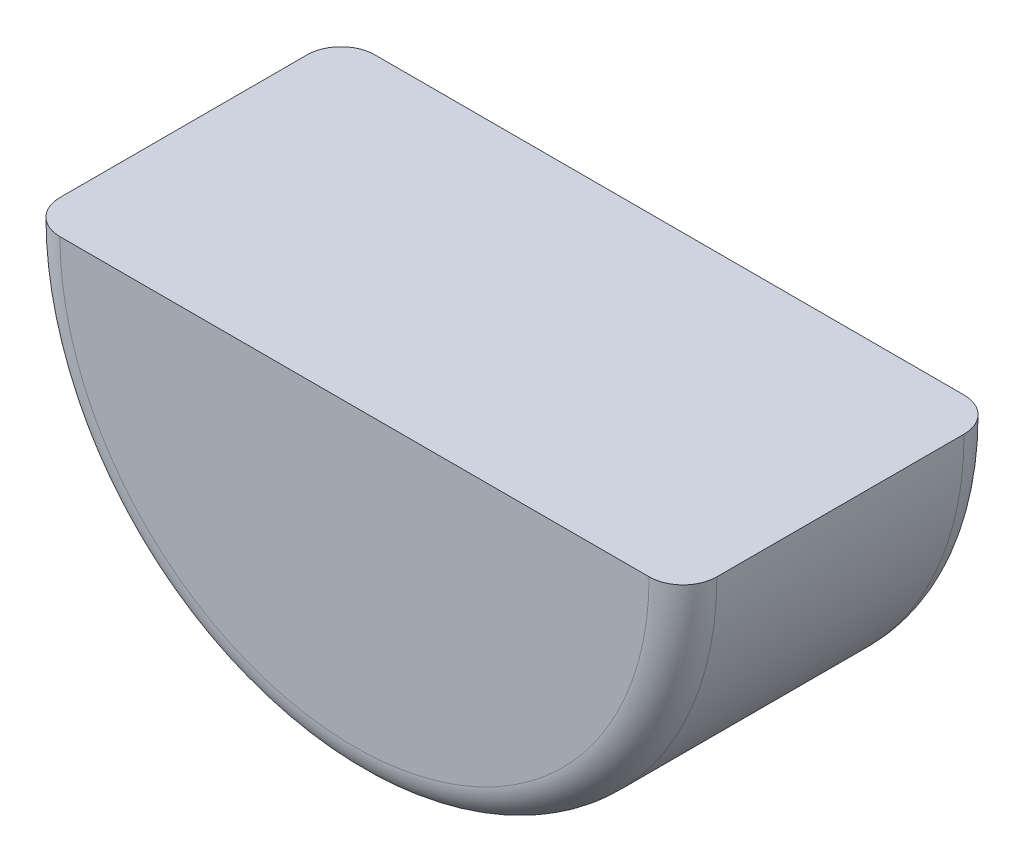
ISO-10303-21;
HEADER;
FILE_DESCRIPTION(('STEP AP214'),'2;1');
FILE_NAME('part.step','',(''),(''),'','','');
FILE_SCHEMA(('AUTOMOTIVE_DESIGN { 1 0 10303 214 1 1 1 1 }'));
ENDSEC;
DATA;
#1=APPLICATION_CONTEXT('core data for automotive mechanical design processes');
#2=APPLICATION_PROTOCOL_DEFINITION('international standard','automotive_design',2000,#1);
#3=PRODUCT_CONTEXT('',#1,'mechanical');
#4=PRODUCT('Part','Part','',(#3));
#5=PRODUCT_RELATED_PRODUCT_CATEGORY('part','',(#4));
#6=PRODUCT_DEFINITION_FORMATION('','',#4);
#7=PRODUCT_DEFINITION_CONTEXT('part definition',#1,'design');
#8=PRODUCT_DEFINITION('design','',#6,#7);
#9=PRODUCT_DEFINITION_SHAPE('','',#8);
#10=(LENGTH_UNIT() NAMED_UNIT(*) SI_UNIT(.MILLI.,.METRE.));
#11=(NAMED_UNIT(*) PLANE_ANGLE_UNIT() SI_UNIT($,.RADIAN.));
#12=(NAMED_UNIT(*) SI_UNIT($,.STERADIAN.) SOLID_ANGLE_UNIT());
#13=UNCERTAINTY_MEASURE_WITH_UNIT(LENGTH_MEASURE(1.E-05),#10,'distance_accuracy_value','');
#14=(GEOMETRIC_REPRESENTATION_CONTEXT(3) GLOBAL_UNCERTAINTY_ASSIGNED_CONTEXT((#13)) GLOBAL_UNIT_ASSIGNED_CONTEXT((#10,
#11,#12)) REPRESENTATION_CONTEXT('',''));
#15=CARTESIAN_POINT('',(0.,0.,0.));
#16=DIRECTION('',(0.,0.,1.));
#17=DIRECTION('',(1.,0.,0.));
#18=AXIS2_PLACEMENT_3D('',#15,#16,#17);
#19=CARTESIAN_POINT('',(0.,0.,-46.5));
#20=DIRECTION('',(0.,0.,-1.));
#21=DIRECTION('',(-1.,0.,0.));
#22=AXIS2_PLACEMENT_3D('',#19,#20,#21);
#23=PLANE('',#22);
#24=DIRECTION('',(1.,0.,0.));
#25=VECTOR('',#24,1.);
#26=CARTESIAN_POINT('',(0.,0.,-46.5));
#27=LINE('',#26,#25);
#28=CARTESIAN_POINT('',(-87.,6.07517752958705E-13,-46.5));
#29=VERTEX_POINT('',#28);
#30=CARTESIAN_POINT('',(87.,0.,-46.5));
#31=VERTEX_POINT('',#30);
#32=EDGE_CURVE('E86',#29,#31,#27,.T.);
#33=ORIENTED_EDGE('',*,*,#32,.T.);
#34=CARTESIAN_POINT('',(0.,0.,-46.5));
#35=DIRECTION('',(0.,0.,1.));
#36=DIRECTION('',(1.,0.,0.));
#37=AXIS2_PLACEMENT_3D('',#34,#35,#36);
#38=CIRCLE('',#37,87.);
#39=EDGE_CURVE('E47',#29,#31,#38,.T.);
#40=ORIENTED_EDGE('',*,*,#39,.F.);
#41=EDGE_LOOP('',(#33,#40));
#42=FACE_BOUND('',#41,.T.);
#43=ADVANCED_FACE('F33',(#42),#23,.T.);
#44=CARTESIAN_POINT('',(-87.,6.07517752958705E-13,46.5));
#45=DIRECTION('',(0.,0.,1.));
#46=DIRECTION('',(1.,0.,0.));
#47=AXIS2_PLACEMENT_3D('',#44,#45,#46);
#48=PLANE('',#47);
#49=CARTESIAN_POINT('',(0.,0.,46.5));
#50=DIRECTION('',(0.,0.,1.));
#51=DIRECTION('',(1.,0.,0.));
#52=AXIS2_PLACEMENT_3D('',#49,#50,#51);
#53=CIRCLE('',#52,87.);
#54=CARTESIAN_POINT('',(-87.,6.07517752958705E-13,46.5));
#55=VERTEX_POINT('',#54);
#56=CARTESIAN_POINT('',(87.,0.,46.5));
#57=VERTEX_POINT('',#56);
#58=EDGE_CURVE('E11',#55,#57,#53,.T.);
#59=ORIENTED_EDGE('',*,*,#58,.T.);
#60=DIRECTION('',(-1.,0.,0.));
#61=VECTOR('',#60,1.);
#62=CARTESIAN_POINT('',(-87.,6.07517752958705E-13,46.5));
#63=LINE('',#62,#61);
#64=EDGE_CURVE('E76',#57,#55,#63,.T.);
#65=ORIENTED_EDGE('',*,*,#64,.T.);
#66=EDGE_LOOP('',(#59,#65));
#67=FACE_BOUND('',#66,.T.);
#68=ADVANCED_FACE('F35',(#67),#48,.T.);
#69=CARTESIAN_POINT('',(0.,0.,36.5));
#70=DIRECTION('',(0.,0.,1.));
#71=DIRECTION('',(1.,0.,0.));
#72=AXIS2_PLACEMENT_3D('',#69,#70,#71);
#73=TOROIDAL_SURFACE('',#72,87.,9.99999999999999);
#74=CARTESIAN_POINT('',(0.,0.,36.5));
#75=DIRECTION('',(0.,0.,1.));
#76=DIRECTION('',(1.,0.,0.));
#77=AXIS2_PLACEMENT_3D('',#74,#75,#76);
#78=CIRCLE('',#77,97.);
#79=CARTESIAN_POINT('',(-97.,6.77347379735568E-13,36.5));
#80=VERTEX_POINT('',#79);
#81=CARTESIAN_POINT('',(97.,0.,36.5));
#82=VERTEX_POINT('',#81);
#83=EDGE_CURVE('E41',#80,#82,#78,.T.);
#84=ORIENTED_EDGE('',*,*,#83,.T.);
#85=CARTESIAN_POINT('',(87.,0.,36.5));
#86=DIRECTION('',(0.,1.,0.));
#87=DIRECTION('',(0.,0.,-1.));
#88=AXIS2_PLACEMENT_3D('',#85,#86,#87);
#89=CIRCLE('',#88,9.99999999999999);
#90=EDGE_CURVE('E80',#57,#82,#89,.T.);
#91=ORIENTED_EDGE('',*,*,#90,.F.);
#92=ORIENTED_EDGE('',*,*,#58,.F.);
#93=CARTESIAN_POINT('',(-87.,6.07517752958705E-13,36.5));
#94=DIRECTION('',(0.,-1.,0.));
#95=DIRECTION('',(0.,0.,-1.));
#96=AXIS2_PLACEMENT_3D('',#93,#94,#95);
#97=CIRCLE('',#96,9.99999999999999);
#98=EDGE_CURVE('E84',#55,#80,#97,.T.);
#99=ORIENTED_EDGE('',*,*,#98,.T.);
#100=EDGE_LOOP('',(#84,#91,#92,#99));
#101=FACE_BOUND('',#100,.T.);
#102=ADVANCED_FACE('F89',(#101),#73,.T.);
#103=CARTESIAN_POINT('',(0.,0.,46.5));
#104=DIRECTION('',(0.,0.,1.));
#105=DIRECTION('',(1.,0.,0.));
#106=AXIS2_PLACEMENT_3D('',#103,#104,#105);
#107=CYLINDRICAL_SURFACE('',#106,97.);
#108=CARTESIAN_POINT('',(0.,0.,-36.5));
#109=DIRECTION('',(0.,0.,1.));
#110=DIRECTION('',(1.,0.,0.));
#111=AXIS2_PLACEMENT_3D('',#108,#109,#110);
#112=CIRCLE('',#111,97.);
#113=CARTESIAN_POINT('',(-97.,6.77347379735568E-13,-36.5));
#114=VERTEX_POINT('',#113);
#115=CARTESIAN_POINT('',(97.,0.,-36.5));
#116=VERTEX_POINT('',#115);
#117=EDGE_CURVE('E55',#114,#116,#112,.T.);
#118=ORIENTED_EDGE('',*,*,#117,.T.);
#119=DIRECTION('',(0.,0.,-1.));
#120=VECTOR('',#119,1.);
#121=CARTESIAN_POINT('',(97.,0.,-36.5));
#122=LINE('',#121,#120);
#123=EDGE_CURVE('E90',#82,#116,#122,.T.);
#124=ORIENTED_EDGE('',*,*,#123,.F.);
#125=ORIENTED_EDGE('',*,*,#83,.F.);
#126=DIRECTION('',(0.,0.,-1.));
#127=VECTOR('',#126,1.);
#128=CARTESIAN_POINT('',(-97.,6.77347379735568E-13,-36.5));
#129=LINE('',#128,#127);
#130=EDGE_CURVE('E99',#80,#114,#129,.T.);
#131=ORIENTED_EDGE('',*,*,#130,.T.);
#132=EDGE_LOOP('',(#118,#124,#125,#131));
#133=FACE_BOUND('',#132,.T.);
#134=ADVANCED_FACE('F105',(#133),#107,.T.);
#135=CARTESIAN_POINT('',(0.,0.,-36.5));
#136=DIRECTION('',(0.,0.,1.));
#137=DIRECTION('',(1.,0.,0.));
#138=AXIS2_PLACEMENT_3D('',#135,#136,#137);
#139=TOROIDAL_SURFACE('',#138,87.,10.);
#140=CARTESIAN_POINT('',(-87.,6.07517752958705E-13,-36.5));
#141=DIRECTION('',(0.,-1.,0.));
#142=DIRECTION('',(0.,0.,1.));
#143=AXIS2_PLACEMENT_3D('',#140,#141,#142);
#144=CIRCLE('',#143,10.);
#145=EDGE_CURVE('E101',#114,#29,#144,.T.);
#146=ORIENTED_EDGE('',*,*,#145,.T.);
#147=ORIENTED_EDGE('',*,*,#39,.T.);
#148=CARTESIAN_POINT('',(87.,0.,-36.5));
#149=DIRECTION('',(0.,1.,0.));
#150=DIRECTION('',(0.,0.,1.));
#151=AXIS2_PLACEMENT_3D('',#148,#149,#150);
#152=CIRCLE('',#151,10.);
#153=EDGE_CURVE('E92',#116,#31,#152,.T.);
#154=ORIENTED_EDGE('',*,*,#153,.F.);
#155=ORIENTED_EDGE('',*,*,#117,.F.);
#156=EDGE_LOOP('',(#146,#147,#154,#155));
#157=FACE_BOUND('',#156,.T.);
#158=ADVANCED_FACE('F107',(#157),#139,.T.);
#159=CARTESIAN_POINT('',(-87.,6.07517752958705E-13,-36.5));
#160=DIRECTION('',(0.,-1.,0.));
#161=DIRECTION('',(0.,0.,1.));
#162=AXIS2_PLACEMENT_3D('',#159,#160,#161);
#163=PLANE('',#162);
#164=ORIENTED_EDGE('',*,*,#32,.F.);
#165=ORIENTED_EDGE('',*,*,#145,.F.);
#166=ORIENTED_EDGE('',*,*,#130,.F.);
#167=ORIENTED_EDGE('',*,*,#98,.F.);
#168=ORIENTED_EDGE('',*,*,#64,.F.);
#169=ORIENTED_EDGE('',*,*,#90,.T.);
#170=ORIENTED_EDGE('',*,*,#123,.T.);
#171=ORIENTED_EDGE('',*,*,#153,.T.);
#172=EDGE_LOOP('',(#164,#165,#166,#167,#168,#169,#170,#171));
#173=FACE_BOUND('',#172,.T.);
#174=ADVANCED_FACE('F77',(#173),#163,.F.);
#175=CLOSED_SHELL('',(#43,#68,#102,#134,#158,#174));
#176=MANIFOLD_SOLID_BREP('B2',#175);
#177=ADVANCED_BREP_SHAPE_REPRESENTATION('',(#18,#176),#14);
#178=SHAPE_DEFINITION_REPRESENTATION(#9,#177);
ENDSEC;
END-ISO-10303-21;
